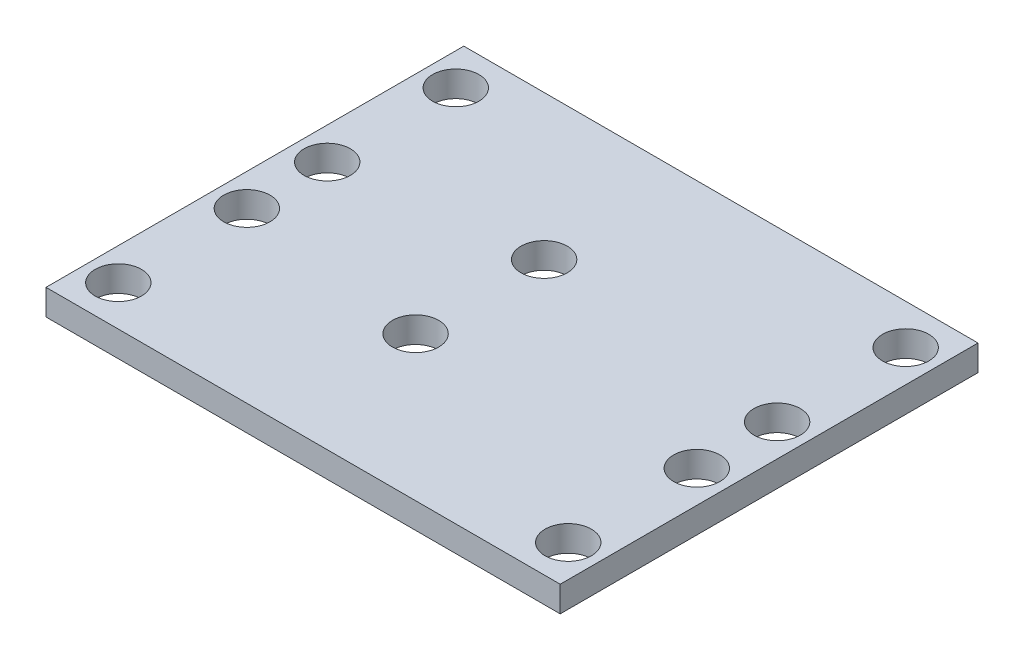
ISO-10303-21;
HEADER;
FILE_DESCRIPTION(('STEP AP214'),'2;1');
FILE_NAME('part.step','',(''),(''),'','','');
FILE_SCHEMA(('AUTOMOTIVE_DESIGN { 1 0 10303 214 1 1 1 1 }'));
ENDSEC;
DATA;
#1=APPLICATION_CONTEXT('core data for automotive mechanical design processes');
#2=APPLICATION_PROTOCOL_DEFINITION('international standard','automotive_design',2000,#1);
#3=PRODUCT_CONTEXT('',#1,'mechanical');
#4=PRODUCT('Part','Part','',(#3));
#5=PRODUCT_RELATED_PRODUCT_CATEGORY('part','',(#4));
#6=PRODUCT_DEFINITION_FORMATION('','',#4);
#7=PRODUCT_DEFINITION_CONTEXT('part definition',#1,'design');
#8=PRODUCT_DEFINITION('design','',#6,#7);
#9=PRODUCT_DEFINITION_SHAPE('','',#8);
#10=(LENGTH_UNIT() NAMED_UNIT(*) SI_UNIT(.MILLI.,.METRE.));
#11=(NAMED_UNIT(*) PLANE_ANGLE_UNIT() SI_UNIT($,.RADIAN.));
#12=(NAMED_UNIT(*) SI_UNIT($,.STERADIAN.) SOLID_ANGLE_UNIT());
#13=UNCERTAINTY_MEASURE_WITH_UNIT(LENGTH_MEASURE(1.E-05),#10,'distance_accuracy_value','');
#14=(GEOMETRIC_REPRESENTATION_CONTEXT(3) GLOBAL_UNCERTAINTY_ASSIGNED_CONTEXT((#13)) GLOBAL_UNIT_ASSIGNED_CONTEXT((#10,
#11,#12)) REPRESENTATION_CONTEXT('',''));
#15=CARTESIAN_POINT('',(0.,0.,0.));
#16=DIRECTION('',(0.,0.,1.));
#17=DIRECTION('',(1.,0.,0.));
#18=AXIS2_PLACEMENT_3D('',#15,#16,#17);
#19=CARTESIAN_POINT('',(0.,2.54,0.));
#20=DIRECTION('',(0.,-1.,0.));
#21=DIRECTION('',(0.,0.,-1.));
#22=AXIS2_PLACEMENT_3D('',#19,#20,#21);
#23=PLANE('',#22);
#24=DIRECTION('',(0.,0.,-1.));
#25=VECTOR('',#24,1.);
#26=CARTESIAN_POINT('',(25.4,2.54,14.2875));
#27=LINE('',#26,#25);
#28=CARTESIAN_POINT('',(25.4,2.54,26.9875));
#29=VERTEX_POINT('',#28);
#30=CARTESIAN_POINT('',(25.4,2.54,-14.2875));
#31=VERTEX_POINT('',#30);
#32=EDGE_CURVE('E58',#29,#31,#27,.T.);
#33=ORIENTED_EDGE('',*,*,#32,.T.);
#34=DIRECTION('',(-1.,0.,0.));
#35=VECTOR('',#34,1.);
#36=CARTESIAN_POINT('',(-25.4,2.54,-14.2875));
#37=LINE('',#36,#35);
#38=CARTESIAN_POINT('',(-25.4,2.54,-14.2875));
#39=VERTEX_POINT('',#38);
#40=EDGE_CURVE('E89',#31,#39,#37,.T.);
#41=ORIENTED_EDGE('',*,*,#40,.T.);
#42=DIRECTION('',(0.,0.,1.));
#43=VECTOR('',#42,1.);
#44=CARTESIAN_POINT('',(-25.4,2.54,14.2875));
#45=LINE('',#44,#43);
#46=CARTESIAN_POINT('',(-25.4,2.54,26.9875));
#47=VERTEX_POINT('',#46);
#48=EDGE_CURVE('E94',#39,#47,#45,.T.);
#49=ORIENTED_EDGE('',*,*,#48,.T.);
#50=DIRECTION('',(1.,0.,0.));
#51=VECTOR('',#50,1.);
#52=CARTESIAN_POINT('',(-25.4,2.54,26.9875));
#53=LINE('',#52,#51);
#54=EDGE_CURVE('E105',#47,#29,#53,.T.);
#55=ORIENTED_EDGE('',*,*,#54,.T.);
#56=EDGE_LOOP('',(#33,#41,#49,#55));
#57=FACE_BOUND('',#56,.T.);
#58=CARTESIAN_POINT('',(-22.225,2.54,-10.31875));
#59=DIRECTION('',(0.,1.,0.));
#60=DIRECTION('',(0.,0.,1.));
#61=AXIS2_PLACEMENT_3D('',#58,#59,#60);
#62=CIRCLE('',#61,2.286);
#63=CARTESIAN_POINT('',(-22.225,2.54,-8.03275));
#64=VERTEX_POINT('',#63);
#65=EDGE_CURVE('E109',#64,#64,#62,.T.);
#66=ORIENTED_EDGE('',*,*,#65,.F.);
#67=EDGE_LOOP('',(#66));
#68=FACE_BOUND('',#67,.T.);
#69=CARTESIAN_POINT('',(-22.225,2.54,10.31875));
#70=DIRECTION('',(0.,1.,0.));
#71=DIRECTION('',(0.,0.,1.));
#72=AXIS2_PLACEMENT_3D('',#69,#70,#71);
#73=CIRCLE('',#72,2.286);
#74=CARTESIAN_POINT('',(-22.225,2.54,12.60475));
#75=VERTEX_POINT('',#74);
#76=EDGE_CURVE('E239',#75,#75,#73,.T.);
#77=ORIENTED_EDGE('',*,*,#76,.F.);
#78=EDGE_LOOP('',(#77));
#79=FACE_BOUND('',#78,.T.);
#80=CARTESIAN_POINT('',(22.225,2.54,10.31875));
#81=DIRECTION('',(0.,1.,0.));
#82=DIRECTION('',(0.,0.,1.));
#83=AXIS2_PLACEMENT_3D('',#80,#81,#82);
#84=CIRCLE('',#83,2.286);
#85=CARTESIAN_POINT('',(22.225,2.54,12.60475));
#86=VERTEX_POINT('',#85);
#87=EDGE_CURVE('E235',#86,#86,#84,.T.);
#88=ORIENTED_EDGE('',*,*,#87,.F.);
#89=EDGE_LOOP('',(#88));
#90=FACE_BOUND('',#89,.T.);
#91=CARTESIAN_POINT('',(22.225,2.54,-10.31875));
#92=DIRECTION('',(0.,1.,0.));
#93=DIRECTION('',(0.,0.,1.));
#94=AXIS2_PLACEMENT_3D('',#91,#92,#93);
#95=CIRCLE('',#94,2.286);
#96=CARTESIAN_POINT('',(22.225,2.54,-8.03275));
#97=VERTEX_POINT('',#96);
#98=EDGE_CURVE('E227',#97,#97,#95,.T.);
#99=ORIENTED_EDGE('',*,*,#98,.F.);
#100=EDGE_LOOP('',(#99));
#101=FACE_BOUND('',#100,.T.);
#102=CARTESIAN_POINT('',(-3.175,2.54,0.));
#103=DIRECTION('',(0.,1.,0.));
#104=DIRECTION('',(0.,0.,1.));
#105=AXIS2_PLACEMENT_3D('',#102,#103,#104);
#106=CIRCLE('',#105,2.28599999999999);
#107=CARTESIAN_POINT('',(-3.175,2.54,2.28599999999999));
#108=VERTEX_POINT('',#107);
#109=EDGE_CURVE('E217',#108,#108,#106,.T.);
#110=ORIENTED_EDGE('',*,*,#109,.F.);
#111=EDGE_LOOP('',(#110));
#112=FACE_BOUND('',#111,.T.);
#113=CARTESIAN_POINT('',(-22.225,2.54,2.38125));
#114=DIRECTION('',(0.,1.,0.));
#115=DIRECTION('',(0.,0.,1.));
#116=AXIS2_PLACEMENT_3D('',#113,#114,#115);
#117=CIRCLE('',#116,2.286);
#118=CARTESIAN_POINT('',(-22.225,2.54,4.66725));
#119=VERTEX_POINT('',#118);
#120=EDGE_CURVE('E215',#119,#119,#117,.T.);
#121=ORIENTED_EDGE('',*,*,#120,.F.);
#122=EDGE_LOOP('',(#121));
#123=FACE_BOUND('',#122,.T.);
#124=CARTESIAN_POINT('',(-22.225,2.54,23.01875));
#125=DIRECTION('',(0.,1.,0.));
#126=DIRECTION('',(0.,0.,1.));
#127=AXIS2_PLACEMENT_3D('',#124,#125,#126);
#128=CIRCLE('',#127,2.286);
#129=CARTESIAN_POINT('',(-22.225,2.54,25.30475));
#130=VERTEX_POINT('',#129);
#131=EDGE_CURVE('E206',#130,#130,#128,.T.);
#132=ORIENTED_EDGE('',*,*,#131,.F.);
#133=EDGE_LOOP('',(#132));
#134=FACE_BOUND('',#133,.T.);
#135=CARTESIAN_POINT('',(22.225,2.54,23.01875));
#136=DIRECTION('',(0.,1.,0.));
#137=DIRECTION('',(0.,0.,1.));
#138=AXIS2_PLACEMENT_3D('',#135,#136,#137);
#139=CIRCLE('',#138,2.286);
#140=CARTESIAN_POINT('',(22.225,2.54,25.30475));
#141=VERTEX_POINT('',#140);
#142=EDGE_CURVE('E196',#141,#141,#139,.T.);
#143=ORIENTED_EDGE('',*,*,#142,.F.);
#144=EDGE_LOOP('',(#143));
#145=FACE_BOUND('',#144,.T.);
#146=CARTESIAN_POINT('',(22.225,2.54,2.38125));
#147=DIRECTION('',(0.,1.,0.));
#148=DIRECTION('',(0.,0.,1.));
#149=AXIS2_PLACEMENT_3D('',#146,#147,#148);
#150=CIRCLE('',#149,2.286);
#151=CARTESIAN_POINT('',(22.225,2.54,4.66725));
#152=VERTEX_POINT('',#151);
#153=EDGE_CURVE('E195',#152,#152,#150,.T.);
#154=ORIENTED_EDGE('',*,*,#153,.F.);
#155=EDGE_LOOP('',(#154));
#156=FACE_BOUND('',#155,.T.);
#157=CARTESIAN_POINT('',(-3.175,2.54,12.7));
#158=DIRECTION('',(0.,1.,0.));
#159=DIRECTION('',(0.,0.,1.));
#160=AXIS2_PLACEMENT_3D('',#157,#158,#159);
#161=CIRCLE('',#160,2.28599999999999);
#162=CARTESIAN_POINT('',(-3.175,2.54,14.986));
#163=VERTEX_POINT('',#162);
#164=EDGE_CURVE('E182',#163,#163,#161,.T.);
#165=ORIENTED_EDGE('',*,*,#164,.F.);
#166=EDGE_LOOP('',(#165));
#167=FACE_BOUND('',#166,.T.);
#168=ADVANCED_FACE('F43',(#57,#68,#79,#90,#101,#112,#123,#134,#145,#156,#167),#23,.F.);
#169=CARTESIAN_POINT('',(0.,0.,0.));
#170=DIRECTION('',(0.,-1.,0.));
#171=DIRECTION('',(0.,0.,-1.));
#172=AXIS2_PLACEMENT_3D('',#169,#170,#171);
#173=PLANE('',#172);
#174=CARTESIAN_POINT('',(22.225,0.,2.38125));
#175=DIRECTION('',(0.,1.,0.));
#176=DIRECTION('',(0.,0.,1.));
#177=AXIS2_PLACEMENT_3D('',#174,#175,#176);
#178=CIRCLE('',#177,2.286);
#179=CARTESIAN_POINT('',(22.225,0.,4.66725));
#180=VERTEX_POINT('',#179);
#181=EDGE_CURVE('E186',#180,#180,#178,.T.);
#182=ORIENTED_EDGE('',*,*,#181,.T.);
#183=EDGE_LOOP('',(#182));
#184=FACE_BOUND('',#183,.T.);
#185=CARTESIAN_POINT('',(-22.225,0.,23.01875));
#186=DIRECTION('',(0.,1.,0.));
#187=DIRECTION('',(0.,0.,1.));
#188=AXIS2_PLACEMENT_3D('',#185,#186,#187);
#189=CIRCLE('',#188,2.286);
#190=CARTESIAN_POINT('',(-22.225,0.,25.30475));
#191=VERTEX_POINT('',#190);
#192=EDGE_CURVE('E205',#191,#191,#189,.T.);
#193=ORIENTED_EDGE('',*,*,#192,.T.);
#194=EDGE_LOOP('',(#193));
#195=FACE_BOUND('',#194,.T.);
#196=CARTESIAN_POINT('',(-3.175,0.,0.));
#197=DIRECTION('',(0.,1.,0.));
#198=DIRECTION('',(0.,0.,1.));
#199=AXIS2_PLACEMENT_3D('',#196,#197,#198);
#200=CIRCLE('',#199,2.28599999999999);
#201=CARTESIAN_POINT('',(-3.175,0.,2.28599999999999));
#202=VERTEX_POINT('',#201);
#203=EDGE_CURVE('E214',#202,#202,#200,.T.);
#204=ORIENTED_EDGE('',*,*,#203,.T.);
#205=EDGE_LOOP('',(#204));
#206=FACE_BOUND('',#205,.T.);
#207=CARTESIAN_POINT('',(22.225,0.,10.31875));
#208=DIRECTION('',(0.,1.,0.));
#209=DIRECTION('',(0.,0.,1.));
#210=AXIS2_PLACEMENT_3D('',#207,#208,#209);
#211=CIRCLE('',#210,2.286);
#212=CARTESIAN_POINT('',(22.225,0.,12.60475));
#213=VERTEX_POINT('',#212);
#214=EDGE_CURVE('E226',#213,#213,#211,.T.);
#215=ORIENTED_EDGE('',*,*,#214,.T.);
#216=EDGE_LOOP('',(#215));
#217=FACE_BOUND('',#216,.T.);
#218=CARTESIAN_POINT('',(-22.225,0.,-10.31875));
#219=DIRECTION('',(0.,1.,0.));
#220=DIRECTION('',(0.,0.,1.));
#221=AXIS2_PLACEMENT_3D('',#218,#219,#220);
#222=CIRCLE('',#221,2.286);
#223=CARTESIAN_POINT('',(-22.225,0.,-8.03275));
#224=VERTEX_POINT('',#223);
#225=EDGE_CURVE('E245',#224,#224,#222,.T.);
#226=ORIENTED_EDGE('',*,*,#225,.T.);
#227=EDGE_LOOP('',(#226));
#228=FACE_BOUND('',#227,.T.);
#229=DIRECTION('',(-1.,0.,0.));
#230=VECTOR('',#229,1.);
#231=CARTESIAN_POINT('',(-25.4,0.,-14.2875));
#232=LINE('',#231,#230);
#233=CARTESIAN_POINT('',(25.4,0.,-14.2875));
#234=VERTEX_POINT('',#233);
#235=CARTESIAN_POINT('',(-25.4,0.,-14.2875));
#236=VERTEX_POINT('',#235);
#237=EDGE_CURVE('E98',#234,#236,#232,.T.);
#238=ORIENTED_EDGE('',*,*,#237,.F.);
#239=DIRECTION('',(0.,0.,-1.));
#240=VECTOR('',#239,1.);
#241=CARTESIAN_POINT('',(25.4,0.,14.2875));
#242=LINE('',#241,#240);
#243=CARTESIAN_POINT('',(25.4,0.,26.9875));
#244=VERTEX_POINT('',#243);
#245=EDGE_CURVE('E111',#244,#234,#242,.T.);
#246=ORIENTED_EDGE('',*,*,#245,.F.);
#247=DIRECTION('',(1.,0.,0.));
#248=VECTOR('',#247,1.);
#249=CARTESIAN_POINT('',(-25.4,0.,26.9875));
#250=LINE('',#249,#248);
#251=CARTESIAN_POINT('',(-25.4,0.,26.9875));
#252=VERTEX_POINT('',#251);
#253=EDGE_CURVE('E81',#252,#244,#250,.T.);
#254=ORIENTED_EDGE('',*,*,#253,.F.);
#255=DIRECTION('',(0.,0.,1.));
#256=VECTOR('',#255,1.);
#257=CARTESIAN_POINT('',(-25.4,0.,14.2875));
#258=LINE('',#257,#256);
#259=EDGE_CURVE('E80',#236,#252,#258,.T.);
#260=ORIENTED_EDGE('',*,*,#259,.F.);
#261=EDGE_LOOP('',(#238,#246,#254,#260));
#262=FACE_BOUND('',#261,.T.);
#263=CARTESIAN_POINT('',(-22.225,0.,10.31875));
#264=DIRECTION('',(0.,1.,0.));
#265=DIRECTION('',(0.,0.,1.));
#266=AXIS2_PLACEMENT_3D('',#263,#264,#265);
#267=CIRCLE('',#266,2.286);
#268=CARTESIAN_POINT('',(-22.225,0.,12.60475));
#269=VERTEX_POINT('',#268);
#270=EDGE_CURVE('E237',#269,#269,#267,.T.);
#271=ORIENTED_EDGE('',*,*,#270,.T.);
#272=EDGE_LOOP('',(#271));
#273=FACE_BOUND('',#272,.T.);
#274=CARTESIAN_POINT('',(22.225,0.,-10.31875));
#275=DIRECTION('',(0.,1.,0.));
#276=DIRECTION('',(0.,0.,1.));
#277=AXIS2_PLACEMENT_3D('',#274,#275,#276);
#278=CIRCLE('',#277,2.286);
#279=CARTESIAN_POINT('',(22.225,0.,-8.03275));
#280=VERTEX_POINT('',#279);
#281=EDGE_CURVE('E225',#280,#280,#278,.T.);
#282=ORIENTED_EDGE('',*,*,#281,.T.);
#283=EDGE_LOOP('',(#282));
#284=FACE_BOUND('',#283,.T.);
#285=CARTESIAN_POINT('',(-22.225,0.,2.38125));
#286=DIRECTION('',(0.,1.,0.));
#287=DIRECTION('',(0.,0.,1.));
#288=AXIS2_PLACEMENT_3D('',#285,#286,#287);
#289=CIRCLE('',#288,2.286);
#290=CARTESIAN_POINT('',(-22.225,0.,4.66725));
#291=VERTEX_POINT('',#290);
#292=EDGE_CURVE('E207',#291,#291,#289,.T.);
#293=ORIENTED_EDGE('',*,*,#292,.T.);
#294=EDGE_LOOP('',(#293));
#295=FACE_BOUND('',#294,.T.);
#296=CARTESIAN_POINT('',(22.225,0.,23.01875));
#297=DIRECTION('',(0.,1.,0.));
#298=DIRECTION('',(0.,0.,1.));
#299=AXIS2_PLACEMENT_3D('',#296,#297,#298);
#300=CIRCLE('',#299,2.286);
#301=CARTESIAN_POINT('',(22.225,0.,25.30475));
#302=VERTEX_POINT('',#301);
#303=EDGE_CURVE('E193',#302,#302,#300,.T.);
#304=ORIENTED_EDGE('',*,*,#303,.T.);
#305=EDGE_LOOP('',(#304));
#306=FACE_BOUND('',#305,.T.);
#307=CARTESIAN_POINT('',(-3.175,0.,12.7));
#308=DIRECTION('',(0.,1.,0.));
#309=DIRECTION('',(0.,0.,1.));
#310=AXIS2_PLACEMENT_3D('',#307,#308,#309);
#311=CIRCLE('',#310,2.28599999999999);
#312=CARTESIAN_POINT('',(-3.175,0.,14.986));
#313=VERTEX_POINT('',#312);
#314=EDGE_CURVE('E184',#313,#313,#311,.T.);
#315=ORIENTED_EDGE('',*,*,#314,.T.);
#316=EDGE_LOOP('',(#315));
#317=FACE_BOUND('',#316,.T.);
#318=ADVANCED_FACE('F122',(#184,#195,#206,#217,#228,#262,#273,#284,#295,#306,#317),#173,.T.);
#319=CARTESIAN_POINT('',(-25.4,2.54,-14.2875));
#320=DIRECTION('',(0.,0.,1.));
#321=DIRECTION('',(1.,0.,0.));
#322=AXIS2_PLACEMENT_3D('',#319,#320,#321);
#323=PLANE('',#322);
#324=ORIENTED_EDGE('',*,*,#237,.T.);
#325=DIRECTION('',(0.,-1.,0.));
#326=VECTOR('',#325,1.);
#327=CARTESIAN_POINT('',(-25.4,2.54,-14.2875));
#328=LINE('',#327,#326);
#329=EDGE_CURVE('E55',#39,#236,#328,.T.);
#330=ORIENTED_EDGE('',*,*,#329,.F.);
#331=ORIENTED_EDGE('',*,*,#40,.F.);
#332=DIRECTION('',(0.,-1.,0.));
#333=VECTOR('',#332,1.);
#334=CARTESIAN_POINT('',(25.4,2.54,-14.2875));
#335=LINE('',#334,#333);
#336=EDGE_CURVE('E11',#31,#234,#335,.T.);
#337=ORIENTED_EDGE('',*,*,#336,.T.);
#338=EDGE_LOOP('',(#324,#330,#331,#337));
#339=FACE_BOUND('',#338,.T.);
#340=ADVANCED_FACE('F44',(#339),#323,.F.);
#341=CARTESIAN_POINT('',(-25.4,2.54,14.2875));
#342=DIRECTION('',(1.,0.,0.));
#343=DIRECTION('',(0.,0.,-1.));
#344=AXIS2_PLACEMENT_3D('',#341,#342,#343);
#345=PLANE('',#344);
#346=ORIENTED_EDGE('',*,*,#259,.T.);
#347=DIRECTION('',(0.,-1.,0.));
#348=VECTOR('',#347,1.);
#349=CARTESIAN_POINT('',(-25.4,2.54,26.9875));
#350=LINE('',#349,#348);
#351=EDGE_CURVE('E97',#47,#252,#350,.T.);
#352=ORIENTED_EDGE('',*,*,#351,.F.);
#353=ORIENTED_EDGE('',*,*,#48,.F.);
#354=ORIENTED_EDGE('',*,*,#329,.T.);
#355=EDGE_LOOP('',(#346,#352,#353,#354));
#356=FACE_BOUND('',#355,.T.);
#357=ADVANCED_FACE('F99',(#356),#345,.F.);
#358=CARTESIAN_POINT('',(-25.4,2.54,26.9875));
#359=DIRECTION('',(0.,0.,-1.));
#360=DIRECTION('',(-1.,0.,0.));
#361=AXIS2_PLACEMENT_3D('',#358,#359,#360);
#362=PLANE('',#361);
#363=ORIENTED_EDGE('',*,*,#253,.T.);
#364=DIRECTION('',(0.,-1.,0.));
#365=VECTOR('',#364,1.);
#366=CARTESIAN_POINT('',(25.4,2.54,26.9875));
#367=LINE('',#366,#365);
#368=EDGE_CURVE('E104',#29,#244,#367,.T.);
#369=ORIENTED_EDGE('',*,*,#368,.F.);
#370=ORIENTED_EDGE('',*,*,#54,.F.);
#371=ORIENTED_EDGE('',*,*,#351,.T.);
#372=EDGE_LOOP('',(#363,#369,#370,#371));
#373=FACE_BOUND('',#372,.T.);
#374=ADVANCED_FACE('F119',(#373),#362,.F.);
#375=CARTESIAN_POINT('',(25.4,2.54,14.2875));
#376=DIRECTION('',(-1.,0.,0.));
#377=DIRECTION('',(0.,0.,1.));
#378=AXIS2_PLACEMENT_3D('',#375,#376,#377);
#379=PLANE('',#378);
#380=ORIENTED_EDGE('',*,*,#245,.T.);
#381=ORIENTED_EDGE('',*,*,#336,.F.);
#382=ORIENTED_EDGE('',*,*,#32,.F.);
#383=ORIENTED_EDGE('',*,*,#368,.T.);
#384=EDGE_LOOP('',(#380,#381,#382,#383));
#385=FACE_BOUND('',#384,.T.);
#386=ADVANCED_FACE('F124',(#385),#379,.F.);
#387=CARTESIAN_POINT('',(-22.225,2.54,-10.31875));
#388=DIRECTION('',(0.,-1.,0.));
#389=DIRECTION('',(0.,0.,-1.));
#390=AXIS2_PLACEMENT_3D('',#387,#388,#389);
#391=CYLINDRICAL_SURFACE('',#390,2.286);
#392=ORIENTED_EDGE('',*,*,#65,.T.);
#393=EDGE_LOOP('',(#392));
#394=FACE_BOUND('',#393,.T.);
#395=ORIENTED_EDGE('',*,*,#225,.F.);
#396=EDGE_LOOP('',(#395));
#397=FACE_BOUND('',#396,.T.);
#398=ADVANCED_FACE('F123',(#394,#397),#391,.F.);
#399=CARTESIAN_POINT('',(-22.225,2.54,10.31875));
#400=DIRECTION('',(0.,-1.,0.));
#401=DIRECTION('',(0.,0.,-1.));
#402=AXIS2_PLACEMENT_3D('',#399,#400,#401);
#403=CYLINDRICAL_SURFACE('',#402,2.286);
#404=ORIENTED_EDGE('',*,*,#76,.T.);
#405=EDGE_LOOP('',(#404));
#406=FACE_BOUND('',#405,.T.);
#407=ORIENTED_EDGE('',*,*,#270,.F.);
#408=EDGE_LOOP('',(#407));
#409=FACE_BOUND('',#408,.T.);
#410=ADVANCED_FACE('F132',(#406,#409),#403,.F.);
#411=CARTESIAN_POINT('',(22.225,2.54,10.31875));
#412=DIRECTION('',(0.,-1.,0.));
#413=DIRECTION('',(0.,0.,-1.));
#414=AXIS2_PLACEMENT_3D('',#411,#412,#413);
#415=CYLINDRICAL_SURFACE('',#414,2.286);
#416=ORIENTED_EDGE('',*,*,#87,.T.);
#417=EDGE_LOOP('',(#416));
#418=FACE_BOUND('',#417,.T.);
#419=ORIENTED_EDGE('',*,*,#214,.F.);
#420=EDGE_LOOP('',(#419));
#421=FACE_BOUND('',#420,.T.);
#422=ADVANCED_FACE('F145',(#418,#421),#415,.F.);
#423=CARTESIAN_POINT('',(22.225,2.54,-10.31875));
#424=DIRECTION('',(0.,-1.,0.));
#425=DIRECTION('',(0.,0.,-1.));
#426=AXIS2_PLACEMENT_3D('',#423,#424,#425);
#427=CYLINDRICAL_SURFACE('',#426,2.286);
#428=ORIENTED_EDGE('',*,*,#98,.T.);
#429=EDGE_LOOP('',(#428));
#430=FACE_BOUND('',#429,.T.);
#431=ORIENTED_EDGE('',*,*,#281,.F.);
#432=EDGE_LOOP('',(#431));
#433=FACE_BOUND('',#432,.T.);
#434=ADVANCED_FACE('F146',(#430,#433),#427,.F.);
#435=CARTESIAN_POINT('',(-3.175,2.54,0.));
#436=DIRECTION('',(0.,-1.,0.));
#437=DIRECTION('',(0.,0.,-1.));
#438=AXIS2_PLACEMENT_3D('',#435,#436,#437);
#439=CYLINDRICAL_SURFACE('',#438,2.28599999999999);
#440=ORIENTED_EDGE('',*,*,#109,.T.);
#441=EDGE_LOOP('',(#440));
#442=FACE_BOUND('',#441,.T.);
#443=ORIENTED_EDGE('',*,*,#203,.F.);
#444=EDGE_LOOP('',(#443));
#445=FACE_BOUND('',#444,.T.);
#446=ADVANCED_FACE('F155',(#442,#445),#439,.F.);
#447=CARTESIAN_POINT('',(-22.225,2.54,2.38125));
#448=DIRECTION('',(0.,-1.,0.));
#449=DIRECTION('',(0.,0.,-1.));
#450=AXIS2_PLACEMENT_3D('',#447,#448,#449);
#451=CYLINDRICAL_SURFACE('',#450,2.286);
#452=ORIENTED_EDGE('',*,*,#120,.T.);
#453=EDGE_LOOP('',(#452));
#454=FACE_BOUND('',#453,.T.);
#455=ORIENTED_EDGE('',*,*,#292,.F.);
#456=EDGE_LOOP('',(#455));
#457=FACE_BOUND('',#456,.T.);
#458=ADVANCED_FACE('F156',(#454,#457),#451,.F.);
#459=CARTESIAN_POINT('',(-22.225,2.54,23.01875));
#460=DIRECTION('',(0.,-1.,0.));
#461=DIRECTION('',(0.,0.,-1.));
#462=AXIS2_PLACEMENT_3D('',#459,#460,#461);
#463=CYLINDRICAL_SURFACE('',#462,2.286);
#464=ORIENTED_EDGE('',*,*,#131,.T.);
#465=EDGE_LOOP('',(#464));
#466=FACE_BOUND('',#465,.T.);
#467=ORIENTED_EDGE('',*,*,#192,.F.);
#468=EDGE_LOOP('',(#467));
#469=FACE_BOUND('',#468,.T.);
#470=ADVANCED_FACE('F159',(#466,#469),#463,.F.);
#471=CARTESIAN_POINT('',(22.225,2.54,23.01875));
#472=DIRECTION('',(0.,-1.,0.));
#473=DIRECTION('',(0.,0.,-1.));
#474=AXIS2_PLACEMENT_3D('',#471,#472,#473);
#475=CYLINDRICAL_SURFACE('',#474,2.286);
#476=ORIENTED_EDGE('',*,*,#142,.T.);
#477=EDGE_LOOP('',(#476));
#478=FACE_BOUND('',#477,.T.);
#479=ORIENTED_EDGE('',*,*,#303,.F.);
#480=EDGE_LOOP('',(#479));
#481=FACE_BOUND('',#480,.T.);
#482=ADVANCED_FACE('F163',(#478,#481),#475,.F.);
#483=CARTESIAN_POINT('',(22.225,2.54,2.38125));
#484=DIRECTION('',(0.,-1.,0.));
#485=DIRECTION('',(0.,0.,-1.));
#486=AXIS2_PLACEMENT_3D('',#483,#484,#485);
#487=CYLINDRICAL_SURFACE('',#486,2.286);
#488=ORIENTED_EDGE('',*,*,#153,.T.);
#489=EDGE_LOOP('',(#488));
#490=FACE_BOUND('',#489,.T.);
#491=ORIENTED_EDGE('',*,*,#181,.F.);
#492=EDGE_LOOP('',(#491));
#493=FACE_BOUND('',#492,.T.);
#494=ADVANCED_FACE('F169',(#490,#493),#487,.F.);
#495=CARTESIAN_POINT('',(-3.175,2.54,12.7));
#496=DIRECTION('',(0.,-1.,0.));
#497=DIRECTION('',(0.,0.,-1.));
#498=AXIS2_PLACEMENT_3D('',#495,#496,#497);
#499=CYLINDRICAL_SURFACE('',#498,2.28599999999999);
#500=ORIENTED_EDGE('',*,*,#164,.T.);
#501=EDGE_LOOP('',(#500));
#502=FACE_BOUND('',#501,.T.);
#503=ORIENTED_EDGE('',*,*,#314,.F.);
#504=EDGE_LOOP('',(#503));
#505=FACE_BOUND('',#504,.T.);
#506=ADVANCED_FACE('F175',(#502,#505),#499,.F.);
#507=CLOSED_SHELL('',(#168,#318,#340,#357,#374,#386,#398,#410,#422,#434,#446,#458,#470,#482,
#494,#506));
#508=MANIFOLD_SOLID_BREP('B2',#507);
#509=ADVANCED_BREP_SHAPE_REPRESENTATION('',(#18,#508),#14);
#510=SHAPE_DEFINITION_REPRESENTATION(#9,#509);
ENDSEC;
END-ISO-10303-21;
